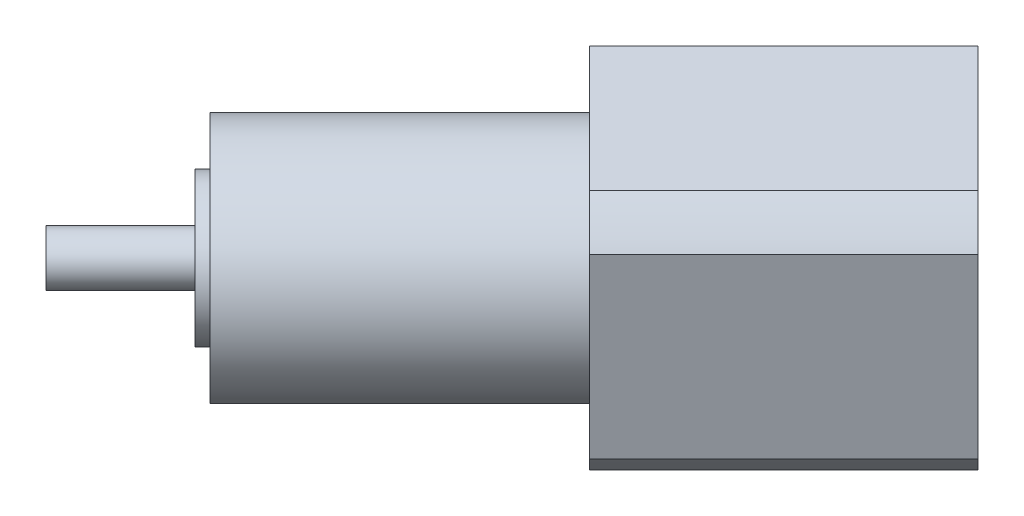
ISO-10303-21;
HEADER;
FILE_DESCRIPTION(('STEP AP214'),'2;1');
FILE_NAME('part.step','',(''),(''),'','','');
FILE_SCHEMA(('AUTOMOTIVE_DESIGN { 1 0 10303 214 1 1 1 1 }'));
ENDSEC;
DATA;
#1=APPLICATION_CONTEXT('core data for automotive mechanical design processes');
#2=APPLICATION_PROTOCOL_DEFINITION('international standard','automotive_design',2000,#1);
#3=PRODUCT_CONTEXT('',#1,'mechanical');
#4=PRODUCT('Part','Part','',(#3));
#5=PRODUCT_RELATED_PRODUCT_CATEGORY('part','',(#4));
#6=PRODUCT_DEFINITION_FORMATION('','',#4);
#7=PRODUCT_DEFINITION_CONTEXT('part definition',#1,'design');
#8=PRODUCT_DEFINITION('design','',#6,#7);
#9=PRODUCT_DEFINITION_SHAPE('','',#8);
#10=(LENGTH_UNIT() NAMED_UNIT(*) SI_UNIT(.MILLI.,.METRE.));
#11=(NAMED_UNIT(*) PLANE_ANGLE_UNIT() SI_UNIT($,.RADIAN.));
#12=(NAMED_UNIT(*) SI_UNIT($,.STERADIAN.) SOLID_ANGLE_UNIT());
#13=UNCERTAINTY_MEASURE_WITH_UNIT(LENGTH_MEASURE(1.E-05),#10,'distance_accuracy_value','');
#14=(GEOMETRIC_REPRESENTATION_CONTEXT(3) GLOBAL_UNCERTAINTY_ASSIGNED_CONTEXT((#13)) GLOBAL_UNIT_ASSIGNED_CONTEXT((#10,
#11,#12)) REPRESENTATION_CONTEXT('',''));
#15=CARTESIAN_POINT('',(0.,0.,0.));
#16=DIRECTION('',(0.,0.,1.));
#17=DIRECTION('',(1.,0.,0.));
#18=AXIS2_PLACEMENT_3D('',#15,#16,#17);
#19=CARTESIAN_POINT('',(151.506824425793,173.299999999997,60.4932025820026));
#20=DIRECTION('',(0.707107057905993,0.,-0.707106504466993));
#21=DIRECTION('',(-0.707106504466993,0.,-0.707107057905993));
#22=AXIS2_PLACEMENT_3D('',#19,#20,#21);
#23=CYLINDRICAL_SURFACE('',#22,26.2000007629398);
#24=CARTESIAN_POINT('',(185.44796320528,173.299999999997,26.5520903675876));
#25=DIRECTION('',(0.707107057905993,0.,-0.707106504466993));
#26=DIRECTION('',(-0.707106504466993,0.,-0.707107057905993));
#27=AXIS2_PLACEMENT_3D('',#24,#25,#26);
#28=CIRCLE('',#27,26.2000007629398);
#29=CARTESIAN_POINT('',(196.382252227095,194.45,37.4863879474653));
#30=VERTEX_POINT('',#29);
#31=CARTESIAN_POINT('',(200.403265235276,188.763426924532,41.5074041028187));
#32=VERTEX_POINT('',#31);
#33=EDGE_CURVE('E160',#30,#32,#28,.T.);
#34=ORIENTED_EDGE('',*,*,#33,.F.);
#35=DIRECTION('',(0.707107057905993,0.,-0.707106504466993));
#36=VECTOR('',#35,1.);
#37=CARTESIAN_POINT('',(162.441113447608,194.45,71.4275001618803));
#38=LINE('',#37,#36);
#39=CARTESIAN_POINT('',(162.441113447608,194.45,71.4275001618803));
#40=VERTEX_POINT('',#39);
#41=EDGE_CURVE('E11',#40,#30,#38,.T.);
#42=ORIENTED_EDGE('',*,*,#41,.F.);
#43=CARTESIAN_POINT('',(151.506824425793,173.299999999997,60.4932025820026));
#44=DIRECTION('',(0.707107057905993,0.,-0.707106504466993));
#45=DIRECTION('',(-0.707106504466993,0.,-0.707107057905993));
#46=AXIS2_PLACEMENT_3D('',#43,#44,#45);
#47=CIRCLE('',#46,26.2000007629398);
#48=CARTESIAN_POINT('',(166.462126455789,188.763426924532,75.4485163172337));
#49=VERTEX_POINT('',#48);
#50=EDGE_CURVE('E189',#40,#49,#47,.T.);
#51=ORIENTED_EDGE('',*,*,#50,.T.);
#52=DIRECTION('',(0.707107057905993,0.,-0.707106504466993));
#53=VECTOR('',#52,1.);
#54=CARTESIAN_POINT('',(166.462126455789,188.763426924532,75.4485163172337));
#55=LINE('',#54,#53);
#56=EDGE_CURVE('E43',#49,#32,#55,.T.);
#57=ORIENTED_EDGE('',*,*,#56,.T.);
#58=EDGE_LOOP('',(#34,#42,#51,#57));
#59=FACE_BOUND('',#58,.T.);
#60=ADVANCED_FACE('F40',(#59),#23,.T.);
#61=CARTESIAN_POINT('',(140.572535403977,194.45,49.558905002124));
#62=DIRECTION('',(0.,1.,0.));
#63=DIRECTION('',(-1.,0.,0.));
#64=AXIS2_PLACEMENT_3D('',#61,#62,#63);
#65=PLANE('',#64);
#66=DIRECTION('',(0.707106504466993,0.,0.707107057905993));
#67=VECTOR('',#66,1.);
#68=CARTESIAN_POINT('',(174.513674183464,194.45,15.617792787709));
#69=LINE('',#68,#67);
#70=CARTESIAN_POINT('',(174.513674183464,194.45,15.617792787709));
#71=VERTEX_POINT('',#70);
#72=EDGE_CURVE('E186',#71,#30,#69,.T.);
#73=ORIENTED_EDGE('',*,*,#72,.F.);
#74=DIRECTION('',(0.707107057905993,0.,-0.707106504466993));
#75=VECTOR('',#74,1.);
#76=CARTESIAN_POINT('',(140.572535403977,194.45,49.558905002124));
#77=LINE('',#76,#75);
#78=CARTESIAN_POINT('',(140.572535403977,194.45,49.558905002124));
#79=VERTEX_POINT('',#78);
#80=EDGE_CURVE('E50',#79,#71,#77,.T.);
#81=ORIENTED_EDGE('',*,*,#80,.F.);
#82=DIRECTION('',(0.707106504466993,0.,0.707107057905993));
#83=VECTOR('',#82,1.);
#84=CARTESIAN_POINT('',(140.572535403977,194.45,49.558905002124));
#85=LINE('',#84,#83);
#86=EDGE_CURVE('E145',#79,#40,#85,.T.);
#87=ORIENTED_EDGE('',*,*,#86,.T.);
#88=ORIENTED_EDGE('',*,*,#41,.T.);
#89=EDGE_LOOP('',(#73,#81,#87,#88));
#90=FACE_BOUND('',#89,.T.);
#91=ADVANCED_FACE('F210',(#90),#65,.T.);
#92=CARTESIAN_POINT('',(151.506824425793,173.299999999997,60.4932025820026));
#93=DIRECTION('',(0.707107057905993,0.,-0.707106504466993));
#94=DIRECTION('',(-0.707106504466993,0.,-0.707107057905993));
#95=AXIS2_PLACEMENT_3D('',#92,#93,#94);
#96=CYLINDRICAL_SURFACE('',#95,26.2000007629401);
#97=CARTESIAN_POINT('',(185.44796320528,173.299999999997,26.5520903675876));
#98=DIRECTION('',(0.707107057905993,0.,-0.707106504466993));
#99=DIRECTION('',(-0.707106504466993,0.,-0.707107057905993));
#100=AXIS2_PLACEMENT_3D('',#97,#98,#99);
#101=CIRCLE('',#100,26.2000007629401);
#102=CARTESIAN_POINT('',(170.492660635802,188.763425881023,11.5967760928748));
#103=VERTEX_POINT('',#102);
#104=EDGE_CURVE('E131',#103,#71,#101,.T.);
#105=ORIENTED_EDGE('',*,*,#104,.F.);
#106=DIRECTION('',(0.707107057905993,0.,-0.707106504466993));
#107=VECTOR('',#106,1.);
#108=CARTESIAN_POINT('',(136.551521856315,188.763425881023,45.5378883072898));
#109=LINE('',#108,#107);
#110=CARTESIAN_POINT('',(136.551521856315,188.763425881023,45.5378883072898));
#111=VERTEX_POINT('',#110);
#112=EDGE_CURVE('E126',#111,#103,#109,.T.);
#113=ORIENTED_EDGE('',*,*,#112,.F.);
#114=CARTESIAN_POINT('',(151.506824425793,173.299999999997,60.4932025820026));
#115=DIRECTION('',(0.707107057905993,0.,-0.707106504466993));
#116=DIRECTION('',(-0.707106504466993,0.,-0.707107057905993));
#117=AXIS2_PLACEMENT_3D('',#114,#115,#116);
#118=CIRCLE('',#117,26.2000007629401);
#119=EDGE_CURVE('E129',#111,#79,#118,.T.);
#120=ORIENTED_EDGE('',*,*,#119,.T.);
#121=ORIENTED_EDGE('',*,*,#80,.T.);
#122=EDGE_LOOP('',(#105,#113,#120,#121));
#123=FACE_BOUND('',#122,.T.);
#124=ADVANCED_FACE('F128',(#123),#96,.T.);
#125=CARTESIAN_POINT('',(136.551521856315,157.83657411897,45.5378883072898));
#126=DIRECTION('',(-0.707106504466993,0.,-0.707107057905993));
#127=DIRECTION('',(-0.707107057905993,0.,0.707106504466993));
#128=AXIS2_PLACEMENT_3D('',#125,#126,#127);
#129=PLANE('',#128);
#130=DIRECTION('',(0.,1.,0.));
#131=VECTOR('',#130,1.);
#132=CARTESIAN_POINT('',(170.492660635802,157.83657411897,11.5967760928748));
#133=LINE('',#132,#131);
#134=CARTESIAN_POINT('',(170.492660635802,157.83657411897,11.5967760928748));
#135=VERTEX_POINT('',#134);
#136=EDGE_CURVE('E181',#135,#103,#133,.T.);
#137=ORIENTED_EDGE('',*,*,#136,.F.);
#138=DIRECTION('',(0.707107057905993,0.,-0.707106504466993));
#139=VECTOR('',#138,1.);
#140=CARTESIAN_POINT('',(136.551521856315,157.83657411897,45.5378883072898));
#141=LINE('',#140,#139);
#142=CARTESIAN_POINT('',(136.551521856315,157.83657411897,45.5378883072898));
#143=VERTEX_POINT('',#142);
#144=EDGE_CURVE('E137',#143,#135,#141,.T.);
#145=ORIENTED_EDGE('',*,*,#144,.F.);
#146=DIRECTION('',(0.,1.,0.));
#147=VECTOR('',#146,1.);
#148=CARTESIAN_POINT('',(136.551521856315,157.83657411897,45.5378883072898));
#149=LINE('',#148,#147);
#150=EDGE_CURVE('E143',#143,#111,#149,.T.);
#151=ORIENTED_EDGE('',*,*,#150,.T.);
#152=ORIENTED_EDGE('',*,*,#112,.T.);
#153=EDGE_LOOP('',(#137,#145,#151,#152));
#154=FACE_BOUND('',#153,.T.);
#155=ADVANCED_FACE('F148',(#154),#129,.T.);
#156=CARTESIAN_POINT('',(151.506824425793,173.299999999997,60.4932025820026));
#157=DIRECTION('',(0.707107057905993,0.,-0.707106504466993));
#158=DIRECTION('',(-0.707106504466993,0.,-0.707107057905993));
#159=AXIS2_PLACEMENT_3D('',#156,#157,#158);
#160=CYLINDRICAL_SURFACE('',#159,26.2000007629402);
#161=CARTESIAN_POINT('',(185.44796320528,173.299999999997,26.5520903675876));
#162=DIRECTION('',(0.707107057905993,0.,-0.707106504466993));
#163=DIRECTION('',(-0.707106504466993,0.,-0.707107057905993));
#164=AXIS2_PLACEMENT_3D('',#161,#162,#163);
#165=CIRCLE('',#164,26.2000007629402);
#166=CARTESIAN_POINT('',(174.513673445592,152.150000762936,15.6177920498363));
#167=VERTEX_POINT('',#166);
#168=EDGE_CURVE('E177',#167,#135,#165,.T.);
#169=ORIENTED_EDGE('',*,*,#168,.F.);
#170=DIRECTION('',(0.707107057905993,0.,-0.707106504466993));
#171=VECTOR('',#170,1.);
#172=CARTESIAN_POINT('',(140.572534666105,152.150000762936,49.5589042642513));
#173=LINE('',#172,#171);
#174=CARTESIAN_POINT('',(140.572534666105,152.150000762936,49.5589042642513));
#175=VERTEX_POINT('',#174);
#176=EDGE_CURVE('E194',#175,#167,#173,.T.);
#177=ORIENTED_EDGE('',*,*,#176,.F.);
#178=CARTESIAN_POINT('',(151.506824425793,173.299999999997,60.4932025820026));
#179=DIRECTION('',(0.707107057905993,0.,-0.707106504466993));
#180=DIRECTION('',(-0.707106504466993,0.,-0.707107057905993));
#181=AXIS2_PLACEMENT_3D('',#178,#179,#180);
#182=CIRCLE('',#181,26.2000007629402);
#183=EDGE_CURVE('E150',#175,#143,#182,.T.);
#184=ORIENTED_EDGE('',*,*,#183,.T.);
#185=ORIENTED_EDGE('',*,*,#144,.T.);
#186=EDGE_LOOP('',(#169,#177,#184,#185));
#187=FACE_BOUND('',#186,.T.);
#188=ADVANCED_FACE('F223',(#187),#160,.T.);
#189=CARTESIAN_POINT('',(162.441114185481,152.150000762936,71.427500899754));
#190=DIRECTION('',(0.,-1.,0.));
#191=DIRECTION('',(0.,0.,-1.));
#192=AXIS2_PLACEMENT_3D('',#189,#190,#191);
#193=PLANE('',#192);
#194=DIRECTION('',(-0.707106504466993,0.,-0.707107057905993));
#195=VECTOR('',#194,1.);
#196=CARTESIAN_POINT('',(196.382252964968,152.150000762936,37.4863886853389));
#197=LINE('',#196,#195);
#198=CARTESIAN_POINT('',(196.382252964968,152.150000762936,37.486388685339));
#199=VERTEX_POINT('',#198);
#200=EDGE_CURVE('E173',#199,#167,#197,.T.);
#201=ORIENTED_EDGE('',*,*,#200,.F.);
#202=DIRECTION('',(0.707107057905993,0.,-0.707106504466993));
#203=VECTOR('',#202,1.);
#204=CARTESIAN_POINT('',(162.441114185481,152.150000762936,71.427500899754));
#205=LINE('',#204,#203);
#206=CARTESIAN_POINT('',(162.441114185481,152.150000762936,71.427500899754));
#207=VERTEX_POINT('',#206);
#208=EDGE_CURVE('E197',#207,#199,#205,.T.);
#209=ORIENTED_EDGE('',*,*,#208,.F.);
#210=DIRECTION('',(-0.707106504466993,0.,-0.707107057905993));
#211=VECTOR('',#210,1.);
#212=CARTESIAN_POINT('',(162.441114185481,152.150000762936,71.427500899754));
#213=LINE('',#212,#211);
#214=EDGE_CURVE('E154',#207,#175,#213,.T.);
#215=ORIENTED_EDGE('',*,*,#214,.T.);
#216=ORIENTED_EDGE('',*,*,#176,.T.);
#217=EDGE_LOOP('',(#201,#209,#215,#216));
#218=FACE_BOUND('',#217,.T.);
#219=ADVANCED_FACE('F226',(#218),#193,.T.);
#220=CARTESIAN_POINT('',(151.506824425793,173.299999999997,60.4932025820026));
#221=DIRECTION('',(0.707107057905993,0.,-0.707106504466993));
#222=DIRECTION('',(-0.707106504466993,0.,-0.707107057905993));
#223=AXIS2_PLACEMENT_3D('',#220,#221,#222);
#224=CYLINDRICAL_SURFACE('',#223,26.2000007629402);
#225=CARTESIAN_POINT('',(185.44796320528,173.299999999997,26.5520903675876));
#226=DIRECTION('',(0.707107057905993,0.,-0.707106504466993));
#227=DIRECTION('',(-0.707106504466993,0.,-0.707107057905993));
#228=AXIS2_PLACEMENT_3D('',#225,#226,#227);
#229=CIRCLE('',#228,26.2000007629402);
#230=CARTESIAN_POINT('',(200.403265235276,157.836573075461,41.5074041028187));
#231=VERTEX_POINT('',#230);
#232=EDGE_CURVE('E169',#231,#199,#229,.T.);
#233=ORIENTED_EDGE('',*,*,#232,.F.);
#234=DIRECTION('',(0.707107057905993,0.,-0.707106504466993));
#235=VECTOR('',#234,1.);
#236=CARTESIAN_POINT('',(166.462126455789,157.836573075461,75.4485163172337));
#237=LINE('',#236,#235);
#238=CARTESIAN_POINT('',(166.462126455789,157.836573075461,75.4485163172337));
#239=VERTEX_POINT('',#238);
#240=EDGE_CURVE('E199',#239,#231,#237,.T.);
#241=ORIENTED_EDGE('',*,*,#240,.F.);
#242=CARTESIAN_POINT('',(151.506824425793,173.299999999997,60.4932025820026));
#243=DIRECTION('',(0.707107057905993,0.,-0.707106504466993));
#244=DIRECTION('',(-0.707106504466993,0.,-0.707107057905993));
#245=AXIS2_PLACEMENT_3D('',#242,#243,#244);
#246=CIRCLE('',#245,26.2000007629402);
#247=EDGE_CURVE('E490',#239,#207,#246,.T.);
#248=ORIENTED_EDGE('',*,*,#247,.T.);
#249=ORIENTED_EDGE('',*,*,#208,.T.);
#250=EDGE_LOOP('',(#233,#241,#248,#249));
#251=FACE_BOUND('',#250,.T.);
#252=ADVANCED_FACE('F230',(#251),#224,.T.);
#253=CARTESIAN_POINT('',(166.462126455789,188.763426924532,75.4485163172337));
#254=DIRECTION('',(0.707106504466993,0.,0.707107057905993));
#255=DIRECTION('',(0.707107057905993,0.,-0.707106504466993));
#256=AXIS2_PLACEMENT_3D('',#253,#254,#255);
#257=PLANE('',#256);
#258=DIRECTION('',(0.,-1.,0.));
#259=VECTOR('',#258,1.);
#260=CARTESIAN_POINT('',(200.403265235276,188.763426924532,41.5074041028187));
#261=LINE('',#260,#259);
#262=EDGE_CURVE('E164',#32,#231,#261,.T.);
#263=ORIENTED_EDGE('',*,*,#262,.F.);
#264=ORIENTED_EDGE('',*,*,#56,.F.);
#265=DIRECTION('',(0.,-1.,0.));
#266=VECTOR('',#265,1.);
#267=CARTESIAN_POINT('',(166.462126455789,188.763426924532,75.4485163172337));
#268=LINE('',#267,#266);
#269=EDGE_CURVE('E488',#49,#239,#268,.T.);
#270=ORIENTED_EDGE('',*,*,#269,.T.);
#271=ORIENTED_EDGE('',*,*,#240,.T.);
#272=EDGE_LOOP('',(#263,#264,#270,#271));
#273=FACE_BOUND('',#272,.T.);
#274=ADVANCED_FACE('F207',(#273),#257,.T.);
#275=CARTESIAN_POINT('',(151.506824425793,173.299999999997,60.4932025820026));
#276=DIRECTION('',(0.707107057905993,0.,-0.707106504466993));
#277=DIRECTION('',(-0.707106504466993,0.,-0.707107057905993));
#278=AXIS2_PLACEMENT_3D('',#275,#276,#277);
#279=PLANE('',#278);
#280=CARTESIAN_POINT('',(140.546673606558,188.8,49.5330431844637));
#281=DIRECTION('',(-0.707107057905994,0.,0.707106504466993));
#282=DIRECTION('',(0.707106504466993,0.,0.707107057905994));
#283=AXIS2_PLACEMENT_3D('',#280,#281,#282);
#284=CIRCLE('',#283,1.5);
#285=CARTESIAN_POINT('',(141.607333363259,188.8,50.5937037713227));
#286=VERTEX_POINT('',#285);
#287=EDGE_CURVE('E433',#286,#286,#284,.T.);
#288=ORIENTED_EDGE('',*,*,#287,.F.);
#289=EDGE_LOOP('',(#288));
#290=FACE_BOUND('',#289,.T.);
#291=CARTESIAN_POINT('',(140.546673606558,157.8,49.5330431844637));
#292=DIRECTION('',(-0.707107057905994,0.,0.707106504466993));
#293=DIRECTION('',(0.707106504466993,0.,0.707107057905994));
#294=AXIS2_PLACEMENT_3D('',#291,#292,#293);
#295=CIRCLE('',#294,1.5);
#296=CARTESIAN_POINT('',(141.607333363259,157.8,50.5937037713227));
#297=VERTEX_POINT('',#296);
#298=EDGE_CURVE('E441',#297,#297,#295,.T.);
#299=ORIENTED_EDGE('',*,*,#298,.F.);
#300=EDGE_LOOP('',(#299));
#301=FACE_BOUND('',#300,.T.);
#302=CARTESIAN_POINT('',(162.466975245035,188.8,71.4533619795492));
#303=DIRECTION('',(-0.707107057905994,0.,0.707106504466993));
#304=DIRECTION('',(0.707106504466993,0.,0.707107057905994));
#305=AXIS2_PLACEMENT_3D('',#302,#303,#304);
#306=CIRCLE('',#305,1.5);
#307=CARTESIAN_POINT('',(163.527635001735,188.8,72.5140225664082));
#308=VERTEX_POINT('',#307);
#309=EDGE_CURVE('E449',#308,#308,#306,.T.);
#310=ORIENTED_EDGE('',*,*,#309,.F.);
#311=EDGE_LOOP('',(#310));
#312=FACE_BOUND('',#311,.T.);
#313=CARTESIAN_POINT('',(162.466975245035,157.8,71.4533619795492));
#314=DIRECTION('',(-0.707107057905994,0.,0.707106504466993));
#315=DIRECTION('',(0.707106504466993,0.,0.707107057905994));
#316=AXIS2_PLACEMENT_3D('',#313,#314,#315);
#317=CIRCLE('',#316,1.5);
#318=CARTESIAN_POINT('',(163.527635001735,157.8,72.5140225664082));
#319=VERTEX_POINT('',#318);
#320=EDGE_CURVE('E456',#319,#319,#317,.T.);
#321=ORIENTED_EDGE('',*,*,#320,.F.);
#322=EDGE_LOOP('',(#321));
#323=FACE_BOUND('',#322,.T.);
#324=CARTESIAN_POINT('',(151.506824442661,173.3,60.4932025651621));
#325=DIRECTION('',(-0.707107057905995,0.,0.707106504466992));
#326=DIRECTION('',(0.707106504466992,0.,0.707107057905995));
#327=AXIS2_PLACEMENT_3D('',#324,#325,#326);
#328=CIRCLE('',#327,17.9699993133405);
#329=CARTESIAN_POINT('',(164.213527842392,173.3,73.199915910191));
#330=VERTEX_POINT('',#329);
#331=EDGE_CURVE('E165',#330,#330,#328,.T.);
#332=ORIENTED_EDGE('',*,*,#331,.F.);
#333=EDGE_LOOP('',(#332));
#334=FACE_BOUND('',#333,.T.);
#335=ORIENTED_EDGE('',*,*,#50,.F.);
#336=ORIENTED_EDGE('',*,*,#86,.F.);
#337=ORIENTED_EDGE('',*,*,#119,.F.);
#338=ORIENTED_EDGE('',*,*,#150,.F.);
#339=ORIENTED_EDGE('',*,*,#183,.F.);
#340=ORIENTED_EDGE('',*,*,#214,.F.);
#341=ORIENTED_EDGE('',*,*,#247,.F.);
#342=ORIENTED_EDGE('',*,*,#269,.F.);
#343=EDGE_LOOP('',(#335,#336,#337,#338,#339,#340,#341,#342));
#344=FACE_BOUND('',#343,.T.);
#345=ADVANCED_FACE('F141',(#290,#301,#312,#323,#334,#344),#279,.F.);
#346=CARTESIAN_POINT('',(185.44796320528,173.299999999997,26.5520903675876));
#347=DIRECTION('',(0.707107057905993,0.,-0.707106504466993));
#348=DIRECTION('',(-0.707106504466993,0.,-0.707107057905993));
#349=AXIS2_PLACEMENT_3D('',#346,#347,#348);
#350=PLANE('',#349);
#351=ORIENTED_EDGE('',*,*,#33,.T.);
#352=ORIENTED_EDGE('',*,*,#262,.T.);
#353=ORIENTED_EDGE('',*,*,#232,.T.);
#354=ORIENTED_EDGE('',*,*,#200,.T.);
#355=ORIENTED_EDGE('',*,*,#168,.T.);
#356=ORIENTED_EDGE('',*,*,#136,.T.);
#357=ORIENTED_EDGE('',*,*,#104,.T.);
#358=ORIENTED_EDGE('',*,*,#72,.T.);
#359=EDGE_LOOP('',(#351,#352,#353,#354,#355,#356,#357,#358));
#360=FACE_BOUND('',#359,.T.);
#361=ADVANCED_FACE('F209',(#360),#350,.T.);
#362=CARTESIAN_POINT('',(132.687188584152,173.3,79.3128236939067));
#363=DIRECTION('',(-0.707107057905995,0.,0.707106504466992));
#364=DIRECTION('',(0.707106504466992,0.,0.707107057905995));
#365=AXIS2_PLACEMENT_3D('',#362,#363,#364);
#366=CYLINDRICAL_SURFACE('',#365,17.9699993133405);
#367=ORIENTED_EDGE('',*,*,#331,.T.);
#368=EDGE_LOOP('',(#367));
#369=FACE_BOUND('',#368,.T.);
#370=CARTESIAN_POINT('',(118.343502331059,173.3,93.6564987204746));
#371=DIRECTION('',(-0.707107057905995,0.,0.707106504466992));
#372=DIRECTION('',(0.707106504466992,0.,0.707107057905995));
#373=AXIS2_PLACEMENT_3D('',#370,#371,#372);
#374=CIRCLE('',#373,17.9699993133405);
#375=CARTESIAN_POINT('',(131.050205730789,173.3,106.363212065504));
#376=VERTEX_POINT('',#375);
#377=EDGE_CURVE('E464',#376,#376,#374,.T.);
#378=ORIENTED_EDGE('',*,*,#377,.F.);
#379=EDGE_LOOP('',(#378));
#380=FACE_BOUND('',#379,.T.);
#381=ADVANCED_FACE('F242',(#369,#380),#366,.T.);
#382=CARTESIAN_POINT('',(103.989230421126,173.3,108.010759395597));
#383=DIRECTION('',(-0.707107057905995,0.,0.707106504466992));
#384=DIRECTION('',(0.707106504466992,0.,0.707107057905995));
#385=AXIS2_PLACEMENT_3D('',#382,#383,#384);
#386=PLANE('',#385);
#387=CARTESIAN_POINT('',(103.989230421126,173.3,108.010759395597));
#388=DIRECTION('',(-0.707107057905995,0.,0.707106504466992));
#389=DIRECTION('',(0.707106504466992,0.,0.707107057905995));
#390=AXIS2_PLACEMENT_3D('',#387,#388,#389);
#391=CIRCLE('',#390,4.00000000000006);
#392=CARTESIAN_POINT('',(106.817656438994,173.3,110.839187627221));
#393=VERTEX_POINT('',#392);
#394=EDGE_CURVE('E480',#393,#393,#391,.T.);
#395=ORIENTED_EDGE('',*,*,#394,.T.);
#396=EDGE_LOOP('',(#395));
#397=FACE_BOUND('',#396,.T.);
#398=ADVANCED_FACE('F248',(#397),#386,.T.);
#399=CARTESIAN_POINT('',(132.687188584152,173.3,79.3128236939067));
#400=DIRECTION('',(-0.707107057905995,0.,0.707106504466992));
#401=DIRECTION('',(0.707106504466992,0.,0.707107057905995));
#402=AXIS2_PLACEMENT_3D('',#399,#400,#401);
#403=CYLINDRICAL_SURFACE('',#402,4.00000000000006);
#404=CARTESIAN_POINT('',(117.000000016855,173.3,94.9999999831454));
#405=DIRECTION('',(-0.707107057905995,0.,0.707106504466992));
#406=DIRECTION('',(0.707106504466992,0.,0.707107057905995));
#407=AXIS2_PLACEMENT_3D('',#404,#405,#406);
#408=CIRCLE('',#407,4.00000000000006);
#409=CARTESIAN_POINT('',(119.828426034723,173.3,97.8284282147695));
#410=VERTEX_POINT('',#409);
#411=EDGE_CURVE('E476',#410,#410,#408,.T.);
#412=ORIENTED_EDGE('',*,*,#411,.T.);
#413=EDGE_LOOP('',(#412));
#414=FACE_BOUND('',#413,.T.);
#415=ORIENTED_EDGE('',*,*,#394,.F.);
#416=EDGE_LOOP('',(#415));
#417=FACE_BOUND('',#416,.T.);
#418=ADVANCED_FACE('F252',(#414,#417),#403,.T.);
#419=CARTESIAN_POINT('',(119.828426034723,173.3,97.8284282147695));
#420=DIRECTION('',(-0.707107057905995,0.,0.707106504466992));
#421=DIRECTION('',(0.707106504466992,0.,0.707107057905995));
#422=AXIS2_PLACEMENT_3D('',#419,#420,#421);
#423=PLANE('',#422);
#424=CARTESIAN_POINT('',(117.000000016854,173.3,94.9999999831454));
#425=DIRECTION('',(-0.707107057905995,0.,0.707106504466992));
#426=DIRECTION('',(0.707106504466992,0.,0.707107057905995));
#427=AXIS2_PLACEMENT_3D('',#424,#425,#426);
#428=CIRCLE('',#427,10.9999999999986);
#429=CARTESIAN_POINT('',(124.77817156599,173.3,102.77817762011));
#430=VERTEX_POINT('',#429);
#431=EDGE_CURVE('E472',#430,#430,#428,.T.);
#432=ORIENTED_EDGE('',*,*,#431,.T.);
#433=EDGE_LOOP('',(#432));
#434=FACE_BOUND('',#433,.T.);
#435=ORIENTED_EDGE('',*,*,#411,.F.);
#436=EDGE_LOOP('',(#435));
#437=FACE_BOUND('',#436,.T.);
#438=ADVANCED_FACE('F256',(#434,#437),#423,.T.);
#439=CARTESIAN_POINT('',(132.687188584152,173.3,79.3128236939067));
#440=DIRECTION('',(-0.707107057905995,0.,0.707106504466992));
#441=DIRECTION('',(0.707106504466992,0.,0.707107057905995));
#442=AXIS2_PLACEMENT_3D('',#439,#440,#441);
#443=CYLINDRICAL_SURFACE('',#442,10.9999999999986);
#444=CARTESIAN_POINT('',(118.343502331059,173.3,93.6564987204746));
#445=DIRECTION('',(-0.707107057905995,0.,0.707106504466992));
#446=DIRECTION('',(0.707106504466992,0.,0.707107057905995));
#447=AXIS2_PLACEMENT_3D('',#444,#445,#446);
#448=CIRCLE('',#447,10.9999999999986);
#449=CARTESIAN_POINT('',(126.121673880195,173.3,101.434676357439));
#450=VERTEX_POINT('',#449);
#451=EDGE_CURVE('E468',#450,#450,#448,.T.);
#452=ORIENTED_EDGE('',*,*,#451,.T.);
#453=EDGE_LOOP('',(#452));
#454=FACE_BOUND('',#453,.T.);
#455=ORIENTED_EDGE('',*,*,#431,.F.);
#456=EDGE_LOOP('',(#455));
#457=FACE_BOUND('',#456,.T.);
#458=ADVANCED_FACE('F260',(#454,#457),#443,.T.);
#459=CARTESIAN_POINT('',(126.121673880195,173.3,101.43467635744));
#460=DIRECTION('',(-0.707107057905995,0.,0.707106504466992));
#461=DIRECTION('',(0.707106504466992,0.,0.707107057905995));
#462=AXIS2_PLACEMENT_3D('',#459,#460,#461);
#463=PLANE('',#462);
#464=CARTESIAN_POINT('',(111.272437286386,163.3,86.5854281414121));
#465=DIRECTION('',(-0.707107057905995,0.,0.707106504466992));
#466=DIRECTION('',(0.707106504466992,0.,0.707107057905995));
#467=AXIS2_PLACEMENT_3D('',#464,#465,#466);
#468=CIRCLE('',#467,1.5);
#469=CARTESIAN_POINT('',(112.333097043087,163.3,87.6460887282711));
#470=VERTEX_POINT('',#469);
#471=EDGE_CURVE('E372',#470,#470,#468,.T.);
#472=ORIENTED_EDGE('',*,*,#471,.F.);
#473=EDGE_LOOP('',(#472));
#474=FACE_BOUND('',#473,.T.);
#475=CARTESIAN_POINT('',(111.272437286386,183.3,86.5854281414121));
#476=DIRECTION('',(-0.707107057905995,0.,0.707106504466992));
#477=DIRECTION('',(0.707106504466992,0.,0.707107057905995));
#478=AXIS2_PLACEMENT_3D('',#475,#476,#477);
#479=CIRCLE('',#478,1.5);
#480=CARTESIAN_POINT('',(112.333097043087,183.3,87.6460887282711));
#481=VERTEX_POINT('',#480);
#482=EDGE_CURVE('E377',#481,#481,#479,.T.);
#483=ORIENTED_EDGE('',*,*,#482,.F.);
#484=EDGE_LOOP('',(#483));
#485=FACE_BOUND('',#484,.T.);
#486=CARTESIAN_POINT('',(125.414567375725,183.3,100.727569299531));
#487=DIRECTION('',(-0.707107057905995,0.,0.707106504466992));
#488=DIRECTION('',(0.707106504466992,0.,0.707107057905995));
#489=AXIS2_PLACEMENT_3D('',#486,#487,#488);
#490=CIRCLE('',#489,1.5);
#491=CARTESIAN_POINT('',(126.475227132425,183.3,101.78822988639));
#492=VERTEX_POINT('',#491);
#493=EDGE_CURVE('E387',#492,#492,#490,.T.);
#494=ORIENTED_EDGE('',*,*,#493,.F.);
#495=EDGE_LOOP('',(#494));
#496=FACE_BOUND('',#495,.T.);
#497=CARTESIAN_POINT('',(125.414567375725,163.3,100.727569299531));
#498=DIRECTION('',(-0.707107057905995,0.,0.707106504466992));
#499=DIRECTION('',(0.707106504466992,0.,0.707107057905995));
#500=AXIS2_PLACEMENT_3D('',#497,#498,#499);
#501=CIRCLE('',#500,1.5);
#502=CARTESIAN_POINT('',(126.475227132425,163.3,101.78822988639));
#503=VERTEX_POINT('',#502);
#504=EDGE_CURVE('E395',#503,#503,#501,.T.);
#505=ORIENTED_EDGE('',*,*,#504,.F.);
#506=EDGE_LOOP('',(#505));
#507=FACE_BOUND('',#506,.T.);
#508=CARTESIAN_POINT('',(118.343502331055,159.2,93.6564987204711));
#509=DIRECTION('',(-0.707107057905995,0.,0.707106504466992));
#510=DIRECTION('',(0.707106504466992,0.,0.707107057905995));
#511=AXIS2_PLACEMENT_3D('',#508,#509,#510);
#512=CIRCLE('',#511,1.);
#513=CARTESIAN_POINT('',(119.050608835522,159.2,94.3636057783771));
#514=VERTEX_POINT('',#513);
#515=EDGE_CURVE('E403',#514,#514,#512,.T.);
#516=ORIENTED_EDGE('',*,*,#515,.F.);
#517=EDGE_LOOP('',(#516));
#518=FACE_BOUND('',#517,.T.);
#519=CARTESIAN_POINT('',(128.313704044042,173.3,103.626708236948));
#520=DIRECTION('',(-0.707107057905995,0.,0.707106504466992));
#521=DIRECTION('',(0.707106504466992,0.,0.707107057905995));
#522=AXIS2_PLACEMENT_3D('',#519,#520,#521);
#523=CIRCLE('',#522,1.);
#524=CARTESIAN_POINT('',(129.020810548509,173.3,104.333815294854));
#525=VERTEX_POINT('',#524);
#526=EDGE_CURVE('E411',#525,#525,#523,.T.);
#527=ORIENTED_EDGE('',*,*,#526,.F.);
#528=EDGE_LOOP('',(#527));
#529=FACE_BOUND('',#528,.T.);
#530=CARTESIAN_POINT('',(108.373300618069,173.3,83.6862892039951));
#531=DIRECTION('',(-0.707107057905995,0.,0.707106504466992));
#532=DIRECTION('',(0.707106504466992,0.,0.707107057905995));
#533=AXIS2_PLACEMENT_3D('',#530,#531,#532);
#534=CIRCLE('',#533,1.);
#535=CARTESIAN_POINT('',(109.080407122536,173.3,84.3933962619011));
#536=VERTEX_POINT('',#535);
#537=EDGE_CURVE('E419',#536,#536,#534,.T.);
#538=ORIENTED_EDGE('',*,*,#537,.F.);
#539=EDGE_LOOP('',(#538));
#540=FACE_BOUND('',#539,.T.);
#541=CARTESIAN_POINT('',(118.343502331055,187.4,93.6564987204711));
#542=DIRECTION('',(-0.707107057905995,0.,0.707106504466992));
#543=DIRECTION('',(0.707106504466992,0.,0.707107057905995));
#544=AXIS2_PLACEMENT_3D('',#541,#542,#543);
#545=CIRCLE('',#544,1.);
#546=CARTESIAN_POINT('',(119.050608835522,187.4,94.3636057783771));
#547=VERTEX_POINT('',#546);
#548=EDGE_CURVE('E425',#547,#547,#545,.T.);
#549=ORIENTED_EDGE('',*,*,#548,.F.);
#550=EDGE_LOOP('',(#549));
#551=FACE_BOUND('',#550,.T.);
#552=ORIENTED_EDGE('',*,*,#377,.T.);
#553=EDGE_LOOP('',(#552));
#554=FACE_BOUND('',#553,.T.);
#555=ORIENTED_EDGE('',*,*,#451,.F.);
#556=EDGE_LOOP('',(#555));
#557=FACE_BOUND('',#556,.T.);
#558=ADVANCED_FACE('F264',(#474,#485,#496,#507,#518,#529,#540,#551,#554,#557),#463,.T.);
#559=CARTESIAN_POINT('',(169.538045824095,157.8,64.3822969348787));
#560=DIRECTION('',(0.707107057905994,0.,-0.707106504466993));
#561=DIRECTION('',(-0.707106504466993,0.,-0.707107057905994));
#562=AXIS2_PLACEMENT_3D('',#559,#560,#561);
#563=PLANE('',#562);
#564=CARTESIAN_POINT('',(169.538045824095,157.8,64.3822969348787));
#565=DIRECTION('',(-0.707107057905994,0.,0.707106504466993));
#566=DIRECTION('',(0.707106504466993,0.,0.707107057905994));
#567=AXIS2_PLACEMENT_3D('',#564,#565,#566);
#568=CIRCLE('',#567,1.5);
#569=CARTESIAN_POINT('',(170.598705580796,157.8,65.4429575217377));
#570=VERTEX_POINT('',#569);
#571=EDGE_CURVE('E460',#570,#570,#568,.T.);
#572=ORIENTED_EDGE('',*,*,#571,.T.);
#573=EDGE_LOOP('',(#572));
#574=FACE_BOUND('',#573,.T.);
#575=ADVANCED_FACE('F268',(#574),#563,.F.);
#576=CARTESIAN_POINT('',(162.466975245035,157.8,71.4533619795492));
#577=DIRECTION('',(-0.707107057905994,0.,0.707106504466993));
#578=DIRECTION('',(0.707106504466993,0.,0.707107057905994));
#579=AXIS2_PLACEMENT_3D('',#576,#577,#578);
#580=CYLINDRICAL_SURFACE('',#579,1.5);
#581=ORIENTED_EDGE('',*,*,#571,.F.);
#582=EDGE_LOOP('',(#581));
#583=FACE_BOUND('',#582,.T.);
#584=ORIENTED_EDGE('',*,*,#320,.T.);
#585=EDGE_LOOP('',(#584));
#586=FACE_BOUND('',#585,.T.);
#587=ADVANCED_FACE('F272',(#583,#586),#580,.F.);
#588=CARTESIAN_POINT('',(169.538045824095,188.8,64.3822969348787));
#589=DIRECTION('',(0.707107057905994,0.,-0.707106504466993));
#590=DIRECTION('',(-0.707106504466993,0.,-0.707107057905994));
#591=AXIS2_PLACEMENT_3D('',#588,#589,#590);
#592=PLANE('',#591);
#593=CARTESIAN_POINT('',(169.538045824095,188.8,64.3822969348787));
#594=DIRECTION('',(-0.707107057905994,0.,0.707106504466993));
#595=DIRECTION('',(0.707106504466993,0.,0.707107057905994));
#596=AXIS2_PLACEMENT_3D('',#593,#594,#595);
#597=CIRCLE('',#596,1.5);
#598=CARTESIAN_POINT('',(170.598705580796,188.8,65.4429575217377));
#599=VERTEX_POINT('',#598);
#600=EDGE_CURVE('E452',#599,#599,#597,.T.);
#601=ORIENTED_EDGE('',*,*,#600,.T.);
#602=EDGE_LOOP('',(#601));
#603=FACE_BOUND('',#602,.T.);
#604=ADVANCED_FACE('F276',(#603),#592,.F.);
#605=CARTESIAN_POINT('',(162.466975245035,188.8,71.4533619795492));
#606=DIRECTION('',(-0.707107057905994,0.,0.707106504466993));
#607=DIRECTION('',(0.707106504466993,0.,0.707107057905994));
#608=AXIS2_PLACEMENT_3D('',#605,#606,#607);
#609=CYLINDRICAL_SURFACE('',#608,1.5);
#610=ORIENTED_EDGE('',*,*,#600,.F.);
#611=EDGE_LOOP('',(#610));
#612=FACE_BOUND('',#611,.T.);
#613=ORIENTED_EDGE('',*,*,#309,.T.);
#614=EDGE_LOOP('',(#613));
#615=FACE_BOUND('',#614,.T.);
#616=ADVANCED_FACE('F280',(#612,#615),#609,.F.);
#617=CARTESIAN_POINT('',(147.617744185619,157.8,42.4619781397932));
#618=DIRECTION('',(0.707107057905994,0.,-0.707106504466993));
#619=DIRECTION('',(-0.707106504466993,0.,-0.707107057905994));
#620=AXIS2_PLACEMENT_3D('',#617,#618,#619);
#621=PLANE('',#620);
#622=CARTESIAN_POINT('',(147.617744185619,157.8,42.4619781397932));
#623=DIRECTION('',(-0.707107057905994,0.,0.707106504466993));
#624=DIRECTION('',(0.707106504466993,0.,0.707107057905994));
#625=AXIS2_PLACEMENT_3D('',#622,#623,#624);
#626=CIRCLE('',#625,1.5);
#627=CARTESIAN_POINT('',(148.678403942319,157.8,43.5226387266522));
#628=VERTEX_POINT('',#627);
#629=EDGE_CURVE('E445',#628,#628,#626,.T.);
#630=ORIENTED_EDGE('',*,*,#629,.T.);
#631=EDGE_LOOP('',(#630));
#632=FACE_BOUND('',#631,.T.);
#633=ADVANCED_FACE('F284',(#632),#621,.F.);
#634=CARTESIAN_POINT('',(140.546673606558,157.8,49.5330431844637));
#635=DIRECTION('',(-0.707107057905994,0.,0.707106504466993));
#636=DIRECTION('',(0.707106504466993,0.,0.707107057905994));
#637=AXIS2_PLACEMENT_3D('',#634,#635,#636);
#638=CYLINDRICAL_SURFACE('',#637,1.5);
#639=ORIENTED_EDGE('',*,*,#629,.F.);
#640=EDGE_LOOP('',(#639));
#641=FACE_BOUND('',#640,.T.);
#642=ORIENTED_EDGE('',*,*,#298,.T.);
#643=EDGE_LOOP('',(#642));
#644=FACE_BOUND('',#643,.T.);
#645=ADVANCED_FACE('F288',(#641,#644),#638,.F.);
#646=CARTESIAN_POINT('',(147.617744185619,188.8,42.4619781397932));
#647=DIRECTION('',(0.707107057905994,0.,-0.707106504466993));
#648=DIRECTION('',(-0.707106504466993,0.,-0.707107057905994));
#649=AXIS2_PLACEMENT_3D('',#646,#647,#648);
#650=PLANE('',#649);
#651=CARTESIAN_POINT('',(147.617744185619,188.8,42.4619781397932));
#652=DIRECTION('',(-0.707107057905994,0.,0.707106504466993));
#653=DIRECTION('',(0.707106504466993,0.,0.707107057905994));
#654=AXIS2_PLACEMENT_3D('',#651,#652,#653);
#655=CIRCLE('',#654,1.5);
#656=CARTESIAN_POINT('',(148.678403942319,188.8,43.5226387266522));
#657=VERTEX_POINT('',#656);
#658=EDGE_CURVE('E437',#657,#657,#655,.T.);
#659=ORIENTED_EDGE('',*,*,#658,.T.);
#660=EDGE_LOOP('',(#659));
#661=FACE_BOUND('',#660,.T.);
#662=ADVANCED_FACE('F292',(#661),#650,.F.);
#663=CARTESIAN_POINT('',(140.546673606558,188.8,49.5330431844637));
#664=DIRECTION('',(-0.707107057905994,0.,0.707106504466993));
#665=DIRECTION('',(0.707106504466993,0.,0.707107057905994));
#666=AXIS2_PLACEMENT_3D('',#663,#664,#665);
#667=CYLINDRICAL_SURFACE('',#666,1.5);
#668=ORIENTED_EDGE('',*,*,#658,.F.);
#669=EDGE_LOOP('',(#668));
#670=FACE_BOUND('',#669,.T.);
#671=ORIENTED_EDGE('',*,*,#287,.T.);
#672=EDGE_LOOP('',(#671));
#673=FACE_BOUND('',#672,.T.);
#674=ADVANCED_FACE('F296',(#670,#673),#667,.F.);
#675=CARTESIAN_POINT('',(124.70746693117,187.4,87.2925391013085));
#676=DIRECTION('',(0.707107057905995,0.,-0.707106504466992));
#677=DIRECTION('',(-0.707106504466992,0.,-0.707107057905995));
#678=AXIS2_PLACEMENT_3D('',#675,#676,#677);
#679=PLANE('',#678);
#680=CARTESIAN_POINT('',(124.70746693117,187.4,87.2925391013085));
#681=DIRECTION('',(-0.707107057905995,0.,0.707106504466992));
#682=DIRECTION('',(0.707106504466992,0.,0.707107057905995));
#683=AXIS2_PLACEMENT_3D('',#680,#681,#682);
#684=CIRCLE('',#683,1.);
#685=CARTESIAN_POINT('',(125.414573435637,187.4,87.9996461592145));
#686=VERTEX_POINT('',#685);
#687=EDGE_CURVE('E429',#686,#686,#684,.T.);
#688=ORIENTED_EDGE('',*,*,#687,.T.);
#689=EDGE_LOOP('',(#688));
#690=FACE_BOUND('',#689,.T.);
#691=ADVANCED_FACE('F300',(#690),#679,.F.);
#692=CARTESIAN_POINT('',(118.343502331055,187.4,93.6564987204711));
#693=DIRECTION('',(-0.707107057905995,0.,0.707106504466992));
#694=DIRECTION('',(0.707106504466992,0.,0.707107057905995));
#695=AXIS2_PLACEMENT_3D('',#692,#693,#694);
#696=CYLINDRICAL_SURFACE('',#695,1.);
#697=ORIENTED_EDGE('',*,*,#687,.F.);
#698=EDGE_LOOP('',(#697));
#699=FACE_BOUND('',#698,.T.);
#700=ORIENTED_EDGE('',*,*,#548,.T.);
#701=EDGE_LOOP('',(#700));
#702=FACE_BOUND('',#701,.T.);
#703=ADVANCED_FACE('F304',(#699,#702),#696,.F.);
#704=CARTESIAN_POINT('',(114.737265218184,173.3,77.3223295848325));
#705=DIRECTION('',(0.707107057905995,0.,-0.707106504466992));
#706=DIRECTION('',(-0.707106504466992,0.,-0.707107057905995));
#707=AXIS2_PLACEMENT_3D('',#704,#705,#706);
#708=PLANE('',#707);
#709=CARTESIAN_POINT('',(114.737265218184,173.3,77.3223295848325));
#710=DIRECTION('',(-0.707107057905995,0.,0.707106504466992));
#711=DIRECTION('',(0.707106504466992,0.,0.707107057905995));
#712=AXIS2_PLACEMENT_3D('',#709,#710,#711);
#713=CIRCLE('',#712,1.);
#714=CARTESIAN_POINT('',(115.444371722651,173.3,78.0294366427385));
#715=VERTEX_POINT('',#714);
#716=EDGE_CURVE('E422',#715,#715,#713,.T.);
#717=ORIENTED_EDGE('',*,*,#716,.T.);
#718=EDGE_LOOP('',(#717));
#719=FACE_BOUND('',#718,.T.);
#720=ADVANCED_FACE('F308',(#719),#708,.F.);
#721=CARTESIAN_POINT('',(108.373300618069,173.3,83.6862892039951));
#722=DIRECTION('',(-0.707107057905995,0.,0.707106504466992));
#723=DIRECTION('',(0.707106504466992,0.,0.707107057905995));
#724=AXIS2_PLACEMENT_3D('',#721,#722,#723);
#725=CYLINDRICAL_SURFACE('',#724,1.);
#726=ORIENTED_EDGE('',*,*,#716,.F.);
#727=EDGE_LOOP('',(#726));
#728=FACE_BOUND('',#727,.T.);
#729=ORIENTED_EDGE('',*,*,#537,.T.);
#730=EDGE_LOOP('',(#729));
#731=FACE_BOUND('',#730,.T.);
#732=ADVANCED_FACE('F312',(#728,#731),#725,.F.);
#733=CARTESIAN_POINT('',(134.677668644156,173.3,97.262748617785));
#734=DIRECTION('',(0.707107057905995,0.,-0.707106504466992));
#735=DIRECTION('',(-0.707106504466992,0.,-0.707107057905995));
#736=AXIS2_PLACEMENT_3D('',#733,#734,#735);
#737=PLANE('',#736);
#738=CARTESIAN_POINT('',(134.677668644156,173.3,97.262748617785));
#739=DIRECTION('',(-0.707107057905995,0.,0.707106504466992));
#740=DIRECTION('',(0.707106504466992,0.,0.707107057905995));
#741=AXIS2_PLACEMENT_3D('',#738,#739,#740);
#742=CIRCLE('',#741,1.);
#743=CARTESIAN_POINT('',(135.384775148623,173.3,97.969855675691));
#744=VERTEX_POINT('',#743);
#745=EDGE_CURVE('E415',#744,#744,#742,.T.);
#746=ORIENTED_EDGE('',*,*,#745,.T.);
#747=EDGE_LOOP('',(#746));
#748=FACE_BOUND('',#747,.T.);
#749=ADVANCED_FACE('F316',(#748),#737,.F.);
#750=CARTESIAN_POINT('',(128.313704044042,173.3,103.626708236948));
#751=DIRECTION('',(-0.707107057905995,0.,0.707106504466992));
#752=DIRECTION('',(0.707106504466992,0.,0.707107057905995));
#753=AXIS2_PLACEMENT_3D('',#750,#751,#752);
#754=CYLINDRICAL_SURFACE('',#753,1.);
#755=ORIENTED_EDGE('',*,*,#745,.F.);
#756=EDGE_LOOP('',(#755));
#757=FACE_BOUND('',#756,.T.);
#758=ORIENTED_EDGE('',*,*,#526,.T.);
#759=EDGE_LOOP('',(#758));
#760=FACE_BOUND('',#759,.T.);
#761=ADVANCED_FACE('F320',(#757,#760),#754,.F.);
#762=CARTESIAN_POINT('',(124.70746693117,159.2,87.2925391013085));
#763=DIRECTION('',(0.707107057905995,0.,-0.707106504466992));
#764=DIRECTION('',(-0.707106504466992,0.,-0.707107057905995));
#765=AXIS2_PLACEMENT_3D('',#762,#763,#764);
#766=PLANE('',#765);
#767=CARTESIAN_POINT('',(124.70746693117,159.2,87.2925391013085));
#768=DIRECTION('',(-0.707107057905995,0.,0.707106504466992));
#769=DIRECTION('',(0.707106504466992,0.,0.707107057905995));
#770=AXIS2_PLACEMENT_3D('',#767,#768,#769);
#771=CIRCLE('',#770,1.);
#772=CARTESIAN_POINT('',(125.414573435637,159.2,87.9996461592145));
#773=VERTEX_POINT('',#772);
#774=EDGE_CURVE('E407',#773,#773,#771,.T.);
#775=ORIENTED_EDGE('',*,*,#774,.T.);
#776=EDGE_LOOP('',(#775));
#777=FACE_BOUND('',#776,.T.);
#778=ADVANCED_FACE('F324',(#777),#766,.F.);
#779=CARTESIAN_POINT('',(118.343502331055,159.2,93.6564987204711));
#780=DIRECTION('',(-0.707107057905995,0.,0.707106504466992));
#781=DIRECTION('',(0.707106504466992,0.,0.707107057905995));
#782=AXIS2_PLACEMENT_3D('',#779,#780,#781);
#783=CYLINDRICAL_SURFACE('',#782,1.);
#784=ORIENTED_EDGE('',*,*,#774,.F.);
#785=EDGE_LOOP('',(#784));
#786=FACE_BOUND('',#785,.T.);
#787=ORIENTED_EDGE('',*,*,#515,.T.);
#788=EDGE_LOOP('',(#787));
#789=FACE_BOUND('',#788,.T.);
#790=ADVANCED_FACE('F328',(#786,#789),#783,.F.);
#791=CARTESIAN_POINT('',(131.778531975837,163.3,94.36360968037));
#792=DIRECTION('',(0.707107057905995,0.,-0.707106504466992));
#793=DIRECTION('',(-0.707106504466992,0.,-0.707107057905995));
#794=AXIS2_PLACEMENT_3D('',#791,#792,#793);
#795=PLANE('',#794);
#796=CARTESIAN_POINT('',(131.778531975837,163.3,94.36360968037));
#797=DIRECTION('',(-0.707107057905995,0.,0.707106504466992));
#798=DIRECTION('',(0.707106504466992,0.,0.707107057905995));
#799=AXIS2_PLACEMENT_3D('',#796,#797,#798);
#800=CIRCLE('',#799,1.5);
#801=CARTESIAN_POINT('',(132.839191732538,163.3,95.424270267229));
#802=VERTEX_POINT('',#801);
#803=EDGE_CURVE('E399',#802,#802,#800,.T.);
#804=ORIENTED_EDGE('',*,*,#803,.T.);
#805=EDGE_LOOP('',(#804));
#806=FACE_BOUND('',#805,.T.);
#807=ADVANCED_FACE('F332',(#806),#795,.F.);
#808=CARTESIAN_POINT('',(125.414567375725,163.3,100.727569299531));
#809=DIRECTION('',(-0.707107057905995,0.,0.707106504466992));
#810=DIRECTION('',(0.707106504466992,0.,0.707107057905995));
#811=AXIS2_PLACEMENT_3D('',#808,#809,#810);
#812=CYLINDRICAL_SURFACE('',#811,1.5);
#813=ORIENTED_EDGE('',*,*,#803,.F.);
#814=EDGE_LOOP('',(#813));
#815=FACE_BOUND('',#814,.T.);
#816=ORIENTED_EDGE('',*,*,#504,.T.);
#817=EDGE_LOOP('',(#816));
#818=FACE_BOUND('',#817,.T.);
#819=ADVANCED_FACE('F336',(#815,#818),#812,.F.);
#820=CARTESIAN_POINT('',(131.778531975837,183.3,94.36360968037));
#821=DIRECTION('',(0.707107057905995,0.,-0.707106504466992));
#822=DIRECTION('',(-0.707106504466992,0.,-0.707107057905995));
#823=AXIS2_PLACEMENT_3D('',#820,#821,#822);
#824=PLANE('',#823);
#825=CARTESIAN_POINT('',(131.778531975837,183.3,94.36360968037));
#826=DIRECTION('',(-0.707107057905995,0.,0.707106504466992));
#827=DIRECTION('',(0.707106504466992,0.,0.707107057905995));
#828=AXIS2_PLACEMENT_3D('',#825,#826,#827);
#829=CIRCLE('',#828,1.5);
#830=CARTESIAN_POINT('',(132.839191732538,183.3,95.424270267229));
#831=VERTEX_POINT('',#830);
#832=EDGE_CURVE('E391',#831,#831,#829,.T.);
#833=ORIENTED_EDGE('',*,*,#832,.T.);
#834=EDGE_LOOP('',(#833));
#835=FACE_BOUND('',#834,.T.);
#836=ADVANCED_FACE('F340',(#835),#824,.F.);
#837=CARTESIAN_POINT('',(125.414567375725,183.3,100.727569299531));
#838=DIRECTION('',(-0.707107057905995,0.,0.707106504466992));
#839=DIRECTION('',(0.707106504466992,0.,0.707107057905995));
#840=AXIS2_PLACEMENT_3D('',#837,#838,#839);
#841=CYLINDRICAL_SURFACE('',#840,1.5);
#842=ORIENTED_EDGE('',*,*,#832,.F.);
#843=EDGE_LOOP('',(#842));
#844=FACE_BOUND('',#843,.T.);
#845=ORIENTED_EDGE('',*,*,#493,.T.);
#846=EDGE_LOOP('',(#845));
#847=FACE_BOUND('',#846,.T.);
#848=ADVANCED_FACE('F344',(#844,#847),#841,.F.);
#849=CARTESIAN_POINT('',(117.636401886499,183.3,80.2214685222515));
#850=DIRECTION('',(0.707107057905995,0.,-0.707106504466992));
#851=DIRECTION('',(-0.707106504466992,0.,-0.707107057905995));
#852=AXIS2_PLACEMENT_3D('',#849,#850,#851);
#853=PLANE('',#852);
#854=CARTESIAN_POINT('',(117.636401886499,183.3,80.2214685222515));
#855=DIRECTION('',(-0.707107057905995,0.,0.707106504466992));
#856=DIRECTION('',(0.707106504466992,0.,0.707107057905995));
#857=AXIS2_PLACEMENT_3D('',#854,#855,#856);
#858=CIRCLE('',#857,1.5);
#859=CARTESIAN_POINT('',(118.697061643199,183.3,81.2821291091105));
#860=VERTEX_POINT('',#859);
#861=EDGE_CURVE('E383',#860,#860,#858,.T.);
#862=ORIENTED_EDGE('',*,*,#861,.T.);
#863=EDGE_LOOP('',(#862));
#864=FACE_BOUND('',#863,.T.);
#865=ADVANCED_FACE('F348',(#864),#853,.F.);
#866=CARTESIAN_POINT('',(111.272437286386,183.3,86.5854281414121));
#867=DIRECTION('',(-0.707107057905995,0.,0.707106504466992));
#868=DIRECTION('',(0.707106504466992,0.,0.707107057905995));
#869=AXIS2_PLACEMENT_3D('',#866,#867,#868);
#870=CYLINDRICAL_SURFACE('',#869,1.5);
#871=ORIENTED_EDGE('',*,*,#861,.F.);
#872=EDGE_LOOP('',(#871));
#873=FACE_BOUND('',#872,.T.);
#874=ORIENTED_EDGE('',*,*,#482,.T.);
#875=EDGE_LOOP('',(#874));
#876=FACE_BOUND('',#875,.T.);
#877=ADVANCED_FACE('F352',(#873,#876),#870,.F.);
#878=CARTESIAN_POINT('',(117.636401886499,163.3,80.2214685222515));
#879=DIRECTION('',(0.707107057905995,0.,-0.707106504466992));
#880=DIRECTION('',(-0.707106504466992,0.,-0.707107057905995));
#881=AXIS2_PLACEMENT_3D('',#878,#879,#880);
#882=PLANE('',#881);
#883=CARTESIAN_POINT('',(117.636401886499,163.3,80.2214685222515));
#884=DIRECTION('',(-0.707107057905995,0.,0.707106504466992));
#885=DIRECTION('',(0.707106504466992,0.,0.707107057905995));
#886=AXIS2_PLACEMENT_3D('',#883,#884,#885);
#887=CIRCLE('',#886,1.5);
#888=CARTESIAN_POINT('',(118.697061643199,163.3,81.2821291091105));
#889=VERTEX_POINT('',#888);
#890=EDGE_CURVE('E369',#889,#889,#887,.T.);
#891=ORIENTED_EDGE('',*,*,#890,.T.);
#892=EDGE_LOOP('',(#891));
#893=FACE_BOUND('',#892,.T.);
#894=ADVANCED_FACE('F356',(#893),#882,.F.);
#895=CARTESIAN_POINT('',(111.272437286386,163.3,86.5854281414121));
#896=DIRECTION('',(-0.707107057905995,0.,0.707106504466992));
#897=DIRECTION('',(0.707106504466992,0.,0.707107057905995));
#898=AXIS2_PLACEMENT_3D('',#895,#896,#897);
#899=CYLINDRICAL_SURFACE('',#898,1.5);
#900=ORIENTED_EDGE('',*,*,#890,.F.);
#901=EDGE_LOOP('',(#900));
#902=FACE_BOUND('',#901,.T.);
#903=ORIENTED_EDGE('',*,*,#471,.T.);
#904=EDGE_LOOP('',(#903));
#905=FACE_BOUND('',#904,.T.);
#906=ADVANCED_FACE('F360',(#902,#905),#899,.F.);
#907=CLOSED_SHELL('',(#60,#91,#124,#155,#188,#219,#252,#274,#345,#361,#381,#398,#418,#438,#458,
#558,#575,#587,#604,#616,#633,#645,#662,#674,#691,#703,#720,#732,#749,#761,#778,#790,#807,#819,
#836,#848,#865,#877,#894,#906));
#908=MANIFOLD_SOLID_BREP('B2',#907);
#909=ADVANCED_BREP_SHAPE_REPRESENTATION('',(#18,#908),#14);
#910=SHAPE_DEFINITION_REPRESENTATION(#9,#909);
ENDSEC;
END-ISO-10303-21;
